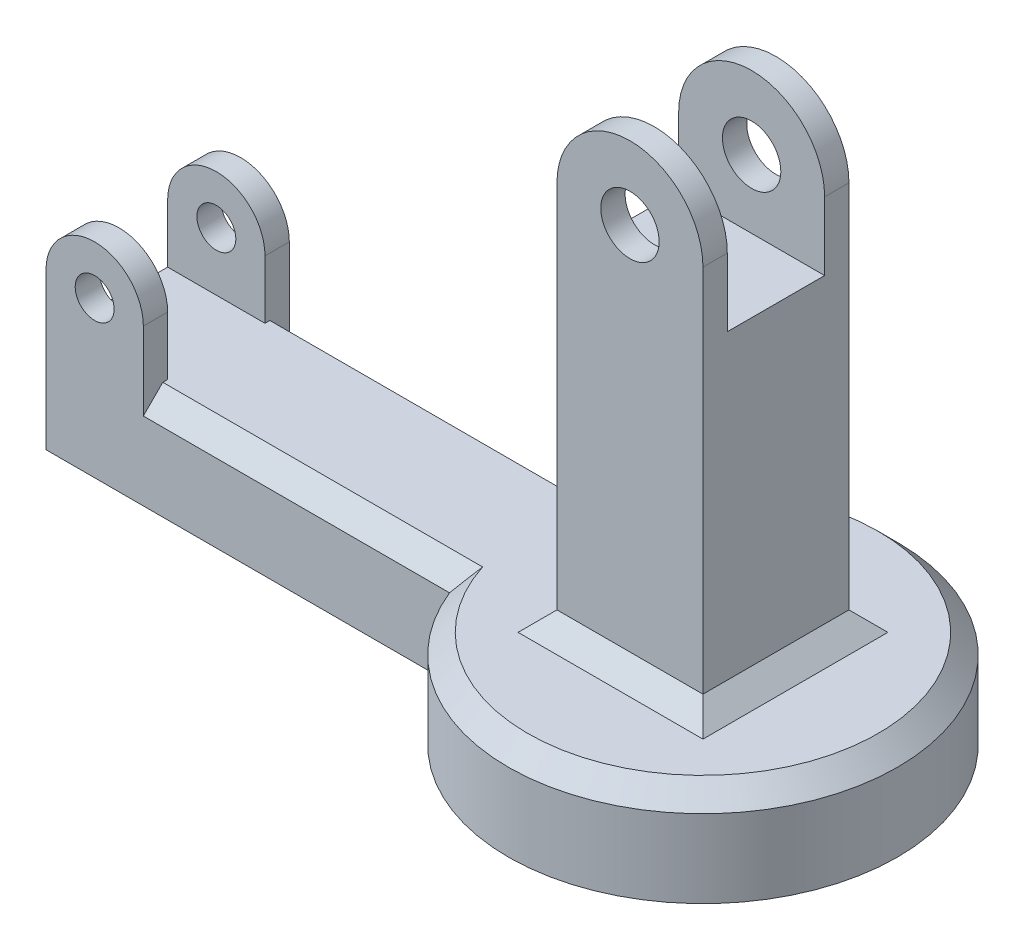
ISO-10303-21;
HEADER;
FILE_DESCRIPTION(('STEP AP214'),'2;1');
FILE_NAME('part.step','',(''),(''),'','','');
FILE_SCHEMA(('AUTOMOTIVE_DESIGN { 1 0 10303 214 1 1 1 1 }'));
ENDSEC;
DATA;
#1=APPLICATION_CONTEXT('core data for automotive mechanical design processes');
#2=APPLICATION_PROTOCOL_DEFINITION('international standard','automotive_design',2000,#1);
#3=PRODUCT_CONTEXT('',#1,'mechanical');
#4=PRODUCT('Part','Part','',(#3));
#5=PRODUCT_RELATED_PRODUCT_CATEGORY('part','',(#4));
#6=PRODUCT_DEFINITION_FORMATION('','',#4);
#7=PRODUCT_DEFINITION_CONTEXT('part definition',#1,'design');
#8=PRODUCT_DEFINITION('design','',#6,#7);
#9=PRODUCT_DEFINITION_SHAPE('','',#8);
#10=(LENGTH_UNIT() NAMED_UNIT(*) SI_UNIT(.MILLI.,.METRE.));
#11=(NAMED_UNIT(*) PLANE_ANGLE_UNIT() SI_UNIT($,.RADIAN.));
#12=(NAMED_UNIT(*) SI_UNIT($,.STERADIAN.) SOLID_ANGLE_UNIT());
#13=UNCERTAINTY_MEASURE_WITH_UNIT(LENGTH_MEASURE(1.E-05),#10,'distance_accuracy_value','');
#14=(GEOMETRIC_REPRESENTATION_CONTEXT(3) GLOBAL_UNCERTAINTY_ASSIGNED_CONTEXT((#13)) GLOBAL_UNIT_ASSIGNED_CONTEXT((#10,
#11,#12)) REPRESENTATION_CONTEXT('',''));
#15=CARTESIAN_POINT('',(0.,0.,0.));
#16=DIRECTION('',(0.,0.,1.));
#17=DIRECTION('',(1.,0.,0.));
#18=AXIS2_PLACEMENT_3D('',#15,#16,#17);
#19=CARTESIAN_POINT('',(-250.,80.,37.5));
#20=DIRECTION('',(-1.,0.,0.));
#21=DIRECTION('',(0.,0.,1.));
#22=AXIS2_PLACEMENT_3D('',#19,#20,#21);
#23=PLANE('',#22);
#24=DIRECTION('',(0.,1.,0.));
#25=VECTOR('',#24,1.);
#26=CARTESIAN_POINT('',(-250.,50.,25.));
#27=LINE('',#26,#25);
#28=CARTESIAN_POINT('',(-250.,50.,25.));
#29=VERTEX_POINT('',#28);
#30=CARTESIAN_POINT('',(-250.,80.,25.));
#31=VERTEX_POINT('',#30);
#32=EDGE_CURVE('E195',#29,#31,#27,.T.);
#33=ORIENTED_EDGE('',*,*,#32,.T.);
#34=DIRECTION('',(0.,0.,-1.));
#35=VECTOR('',#34,1.);
#36=CARTESIAN_POINT('',(-250.,80.,37.5));
#37=LINE('',#36,#35);
#38=CARTESIAN_POINT('',(-250.,80.,37.5));
#39=VERTEX_POINT('',#38);
#40=EDGE_CURVE('E296',#39,#31,#37,.T.);
#41=ORIENTED_EDGE('',*,*,#40,.F.);
#42=DIRECTION('',(0.,1.,0.));
#43=VECTOR('',#42,1.);
#44=CARTESIAN_POINT('',(-250.,80.,37.5));
#45=LINE('',#44,#43);
#46=CARTESIAN_POINT('',(-250.,40.,37.5));
#47=VERTEX_POINT('',#46);
#48=EDGE_CURVE('E289',#47,#39,#45,.T.);
#49=ORIENTED_EDGE('',*,*,#48,.F.);
#50=DIRECTION('',(0.,-0.707106781186549,0.707106781186546));
#51=VECTOR('',#50,1.);
#52=CARTESIAN_POINT('',(-250.,60.0000000000001,17.5));
#53=LINE('',#52,#51);
#54=CARTESIAN_POINT('',(-250.,50.,27.5));
#55=VERTEX_POINT('',#54);
#56=EDGE_CURVE('E352',#47,#55,#53,.F.);
#57=ORIENTED_EDGE('',*,*,#56,.T.);
#58=DIRECTION('',(0.,0.,-1.));
#59=VECTOR('',#58,1.);
#60=CARTESIAN_POINT('',(-250.,50.,37.5));
#61=LINE('',#60,#59);
#62=EDGE_CURVE('E305',#55,#29,#61,.T.);
#63=ORIENTED_EDGE('',*,*,#62,.T.);
#64=EDGE_LOOP('',(#33,#41,#49,#57,#63));
#65=FACE_BOUND('',#64,.T.);
#66=ADVANCED_FACE('F35',(#65),#23,.F.);
#67=CARTESIAN_POINT('',(-275.,80.,37.5));
#68=DIRECTION('',(0.,0.,-1.));
#69=DIRECTION('',(-1.,0.,0.));
#70=AXIS2_PLACEMENT_3D('',#67,#68,#69);
#71=CYLINDRICAL_SURFACE('',#70,25.);
#72=CARTESIAN_POINT('',(-275.,80.,25.));
#73=DIRECTION('',(0.,0.,-1.));
#74=DIRECTION('',(-1.,0.,0.));
#75=AXIS2_PLACEMENT_3D('',#72,#73,#74);
#76=CIRCLE('',#75,25.);
#77=CARTESIAN_POINT('',(-300.,80.,25.));
#78=VERTEX_POINT('',#77);
#79=EDGE_CURVE('E215',#78,#31,#76,.T.);
#80=ORIENTED_EDGE('',*,*,#79,.F.);
#81=DIRECTION('',(0.,0.,-1.));
#82=VECTOR('',#81,1.);
#83=CARTESIAN_POINT('',(-300.,80.,37.5));
#84=LINE('',#83,#82);
#85=CARTESIAN_POINT('',(-300.,80.,37.5));
#86=VERTEX_POINT('',#85);
#87=EDGE_CURVE('E293',#86,#78,#84,.T.);
#88=ORIENTED_EDGE('',*,*,#87,.F.);
#89=CARTESIAN_POINT('',(-275.,80.,37.5));
#90=DIRECTION('',(0.,0.,1.));
#91=DIRECTION('',(-1.,0.,0.));
#92=AXIS2_PLACEMENT_3D('',#89,#90,#91);
#93=CIRCLE('',#92,25.);
#94=EDGE_CURVE('E285',#39,#86,#93,.T.);
#95=ORIENTED_EDGE('',*,*,#94,.F.);
#96=ORIENTED_EDGE('',*,*,#40,.T.);
#97=EDGE_LOOP('',(#80,#88,#95,#96));
#98=FACE_BOUND('',#97,.T.);
#99=ADVANCED_FACE('F406',(#98),#71,.T.);
#100=CARTESIAN_POINT('',(-275.,80.,37.5));
#101=DIRECTION('',(0.,0.,-1.));
#102=DIRECTION('',(-1.,0.,0.));
#103=AXIS2_PLACEMENT_3D('',#100,#101,#102);
#104=CYLINDRICAL_SURFACE('',#103,9.99999999999998);
#105=CARTESIAN_POINT('',(-275.,80.,37.5));
#106=DIRECTION('',(0.,0.,1.));
#107=DIRECTION('',(1.,0.,0.));
#108=AXIS2_PLACEMENT_3D('',#105,#106,#107);
#109=CIRCLE('',#108,9.99999999999998);
#110=CARTESIAN_POINT('',(-265.,80.,37.5));
#111=VERTEX_POINT('',#110);
#112=EDGE_CURVE('E279',#111,#111,#109,.T.);
#113=ORIENTED_EDGE('',*,*,#112,.T.);
#114=EDGE_LOOP('',(#113));
#115=FACE_BOUND('',#114,.T.);
#116=CARTESIAN_POINT('',(-275.,80.,25.));
#117=DIRECTION('',(0.,0.,-1.));
#118=DIRECTION('',(-1.,0.,0.));
#119=AXIS2_PLACEMENT_3D('',#116,#117,#118);
#120=CIRCLE('',#119,9.99999999999998);
#121=CARTESIAN_POINT('',(-285.,80.,25.));
#122=VERTEX_POINT('',#121);
#123=EDGE_CURVE('E212',#122,#122,#120,.T.);
#124=ORIENTED_EDGE('',*,*,#123,.T.);
#125=EDGE_LOOP('',(#124));
#126=FACE_BOUND('',#125,.T.);
#127=ADVANCED_FACE('F412',(#115,#126),#104,.F.);
#128=CARTESIAN_POINT('',(-37.5,50.,37.5));
#129=DIRECTION('',(1.,0.,0.));
#130=DIRECTION('',(0.,0.,-1.));
#131=AXIS2_PLACEMENT_3D('',#128,#129,#130);
#132=PLANE('',#131);
#133=DIRECTION('',(0.,-1.,0.));
#134=VECTOR('',#133,1.);
#135=CARTESIAN_POINT('',(-37.5,50.,-37.5));
#136=LINE('',#135,#134);
#137=CARTESIAN_POINT('',(-37.5,250.,-37.5));
#138=VERTEX_POINT('',#137);
#139=CARTESIAN_POINT('',(-37.5,60.,-37.5));
#140=VERTEX_POINT('',#139);
#141=EDGE_CURVE('E255',#138,#140,#136,.T.);
#142=ORIENTED_EDGE('',*,*,#141,.T.);
#143=DIRECTION('',(0.,0.,1.));
#144=VECTOR('',#143,1.);
#145=CARTESIAN_POINT('',(-37.5,60.,37.5));
#146=LINE('',#145,#144);
#147=CARTESIAN_POINT('',(-37.5,60.,37.5));
#148=VERTEX_POINT('',#147);
#149=EDGE_CURVE('E44',#140,#148,#146,.T.);
#150=ORIENTED_EDGE('',*,*,#149,.T.);
#151=DIRECTION('',(0.,-1.,0.));
#152=VECTOR('',#151,1.);
#153=CARTESIAN_POINT('',(-37.5,50.,37.5));
#154=LINE('',#153,#152);
#155=CARTESIAN_POINT('',(-37.5,250.,37.5));
#156=VERTEX_POINT('',#155);
#157=EDGE_CURVE('E258',#156,#148,#154,.T.);
#158=ORIENTED_EDGE('',*,*,#157,.F.);
#159=DIRECTION('',(0.,0.,-1.));
#160=VECTOR('',#159,1.);
#161=CARTESIAN_POINT('',(-37.5,250.,37.5));
#162=LINE('',#161,#160);
#163=CARTESIAN_POINT('',(-37.5,250.,25.));
#164=VERTEX_POINT('',#163);
#165=EDGE_CURVE('E271',#156,#164,#162,.T.);
#166=ORIENTED_EDGE('',*,*,#165,.T.);
#167=DIRECTION('',(0.,-1.,0.));
#168=VECTOR('',#167,1.);
#169=CARTESIAN_POINT('',(-37.5,215.,25.));
#170=LINE('',#169,#168);
#171=CARTESIAN_POINT('',(-37.5,215.,25.));
#172=VERTEX_POINT('',#171);
#173=EDGE_CURVE('E224',#164,#172,#170,.T.);
#174=ORIENTED_EDGE('',*,*,#173,.T.);
#175=DIRECTION('',(0.,0.,1.));
#176=VECTOR('',#175,1.);
#177=CARTESIAN_POINT('',(-37.5,215.,-25.));
#178=LINE('',#177,#176);
#179=CARTESIAN_POINT('',(-37.5,215.,-25.));
#180=VERTEX_POINT('',#179);
#181=EDGE_CURVE('E233',#180,#172,#178,.T.);
#182=ORIENTED_EDGE('',*,*,#181,.F.);
#183=DIRECTION('',(0.,-1.,0.));
#184=VECTOR('',#183,1.);
#185=CARTESIAN_POINT('',(-37.5,215.,-25.));
#186=LINE('',#185,#184);
#187=CARTESIAN_POINT('',(-37.5,250.,-25.));
#188=VERTEX_POINT('',#187);
#189=EDGE_CURVE('E225',#188,#180,#186,.T.);
#190=ORIENTED_EDGE('',*,*,#189,.F.);
#191=EDGE_CURVE('E265',#188,#138,#162,.T.);
#192=ORIENTED_EDGE('',*,*,#191,.T.);
#193=EDGE_LOOP('',(#142,#150,#158,#166,#174,#182,#190,#192));
#194=FACE_BOUND('',#193,.T.);
#195=ADVANCED_FACE('F629',(#194),#132,.F.);
#196=CARTESIAN_POINT('',(37.5,50.,37.5));
#197=DIRECTION('',(-1.,0.,0.));
#198=DIRECTION('',(0.,0.,1.));
#199=AXIS2_PLACEMENT_3D('',#196,#197,#198);
#200=PLANE('',#199);
#201=DIRECTION('',(0.,1.,0.));
#202=VECTOR('',#201,1.);
#203=CARTESIAN_POINT('',(37.5,50.,37.5));
#204=LINE('',#203,#202);
#205=CARTESIAN_POINT('',(37.5,60.,37.5));
#206=VERTEX_POINT('',#205);
#207=CARTESIAN_POINT('',(37.5,250.,37.5));
#208=VERTEX_POINT('',#207);
#209=EDGE_CURVE('E260',#206,#208,#204,.T.);
#210=ORIENTED_EDGE('',*,*,#209,.F.);
#211=DIRECTION('',(0.,0.,-1.));
#212=VECTOR('',#211,1.);
#213=CARTESIAN_POINT('',(37.5,60.,37.5));
#214=LINE('',#213,#212);
#215=CARTESIAN_POINT('',(37.5,60.,-37.5));
#216=VERTEX_POINT('',#215);
#217=EDGE_CURVE('E380',#206,#216,#214,.T.);
#218=ORIENTED_EDGE('',*,*,#217,.T.);
#219=DIRECTION('',(0.,1.,0.));
#220=VECTOR('',#219,1.);
#221=CARTESIAN_POINT('',(37.5,50.,-37.5));
#222=LINE('',#221,#220);
#223=CARTESIAN_POINT('',(37.5,250.,-37.5));
#224=VERTEX_POINT('',#223);
#225=EDGE_CURVE('E267',#216,#224,#222,.T.);
#226=ORIENTED_EDGE('',*,*,#225,.T.);
#227=DIRECTION('',(0.,0.,-1.));
#228=VECTOR('',#227,1.);
#229=CARTESIAN_POINT('',(37.5,250.,37.5));
#230=LINE('',#229,#228);
#231=CARTESIAN_POINT('',(37.5,250.,-25.));
#232=VERTEX_POINT('',#231);
#233=EDGE_CURVE('E274',#232,#224,#230,.T.);
#234=ORIENTED_EDGE('',*,*,#233,.F.);
#235=DIRECTION('',(0.,1.,0.));
#236=VECTOR('',#235,1.);
#237=CARTESIAN_POINT('',(37.5,215.,-25.));
#238=LINE('',#237,#236);
#239=CARTESIAN_POINT('',(37.5,215.,-25.));
#240=VERTEX_POINT('',#239);
#241=EDGE_CURVE('E231',#240,#232,#238,.T.);
#242=ORIENTED_EDGE('',*,*,#241,.F.);
#243=DIRECTION('',(0.,0.,1.));
#244=VECTOR('',#243,1.);
#245=CARTESIAN_POINT('',(37.5,215.,-25.));
#246=LINE('',#245,#244);
#247=CARTESIAN_POINT('',(37.5,215.,25.));
#248=VERTEX_POINT('',#247);
#249=EDGE_CURVE('E241',#240,#248,#246,.T.);
#250=ORIENTED_EDGE('',*,*,#249,.T.);
#251=DIRECTION('',(0.,1.,0.));
#252=VECTOR('',#251,1.);
#253=CARTESIAN_POINT('',(37.5,215.,25.));
#254=LINE('',#253,#252);
#255=CARTESIAN_POINT('',(37.5,250.,25.));
#256=VERTEX_POINT('',#255);
#257=EDGE_CURVE('E228',#248,#256,#254,.T.);
#258=ORIENTED_EDGE('',*,*,#257,.T.);
#259=EDGE_CURVE('E275',#208,#256,#230,.T.);
#260=ORIENTED_EDGE('',*,*,#259,.F.);
#261=EDGE_LOOP('',(#210,#218,#226,#234,#242,#250,#258,#260));
#262=FACE_BOUND('',#261,.T.);
#263=ADVANCED_FACE('F618',(#262),#200,.F.);
#264=CARTESIAN_POINT('',(0.,250.,37.5));
#265=DIRECTION('',(0.,0.,-1.));
#266=DIRECTION('',(-1.,0.,0.));
#267=AXIS2_PLACEMENT_3D('',#264,#265,#266);
#268=CYLINDRICAL_SURFACE('',#267,37.5);
#269=CARTESIAN_POINT('',(0.,250.,-25.));
#270=DIRECTION('',(0.,0.,1.));
#271=DIRECTION('',(1.,0.,0.));
#272=AXIS2_PLACEMENT_3D('',#269,#270,#271);
#273=CIRCLE('',#272,37.5);
#274=EDGE_CURVE('E249',#232,#188,#273,.T.);
#275=ORIENTED_EDGE('',*,*,#274,.F.);
#276=ORIENTED_EDGE('',*,*,#233,.T.);
#277=CARTESIAN_POINT('',(0.,250.,-37.5));
#278=DIRECTION('',(0.,0.,1.));
#279=DIRECTION('',(-1.,0.,0.));
#280=AXIS2_PLACEMENT_3D('',#277,#278,#279);
#281=CIRCLE('',#280,37.5);
#282=EDGE_CURVE('E261',#224,#138,#281,.T.);
#283=ORIENTED_EDGE('',*,*,#282,.T.);
#284=ORIENTED_EDGE('',*,*,#191,.F.);
#285=EDGE_LOOP('',(#275,#276,#283,#284));
#286=FACE_BOUND('',#285,.T.);
#287=ADVANCED_FACE('F488',(#286),#268,.T.);
#288=CARTESIAN_POINT('',(0.,250.,37.5));
#289=DIRECTION('',(0.,0.,-1.));
#290=DIRECTION('',(-1.,0.,0.));
#291=AXIS2_PLACEMENT_3D('',#288,#289,#290);
#292=CYLINDRICAL_SURFACE('',#291,15.);
#293=CARTESIAN_POINT('',(0.,250.,-37.5));
#294=DIRECTION('',(0.,0.,1.));
#295=DIRECTION('',(1.,0.,0.));
#296=AXIS2_PLACEMENT_3D('',#293,#294,#295);
#297=CIRCLE('',#296,15.);
#298=CARTESIAN_POINT('',(15.,250.,-37.5));
#299=VERTEX_POINT('',#298);
#300=EDGE_CURVE('E251',#299,#299,#297,.T.);
#301=ORIENTED_EDGE('',*,*,#300,.F.);
#302=EDGE_LOOP('',(#301));
#303=FACE_BOUND('',#302,.T.);
#304=CARTESIAN_POINT('',(0.,250.,-25.));
#305=DIRECTION('',(0.,0.,1.));
#306=DIRECTION('',(1.,0.,0.));
#307=AXIS2_PLACEMENT_3D('',#304,#305,#306);
#308=CIRCLE('',#307,15.);
#309=CARTESIAN_POINT('',(15.,250.,-25.));
#310=VERTEX_POINT('',#309);
#311=EDGE_CURVE('E248',#310,#310,#308,.T.);
#312=ORIENTED_EDGE('',*,*,#311,.T.);
#313=EDGE_LOOP('',(#312));
#314=FACE_BOUND('',#313,.T.);
#315=ADVANCED_FACE('F481',(#303,#314),#292,.F.);
#316=CARTESIAN_POINT('',(0.,50.,0.));
#317=DIRECTION('',(0.,1.,0.));
#318=DIRECTION('',(0.,0.,1.));
#319=AXIS2_PLACEMENT_3D('',#316,#317,#318);
#320=PLANE('',#319);
#321=DIRECTION('',(1.,0.,0.));
#322=VECTOR('',#321,1.);
#323=CARTESIAN_POINT('',(37.5,50.,-47.5000000000001));
#324=LINE('',#323,#322);
#325=CARTESIAN_POINT('',(-47.5000000000001,50.,-47.5000000000001));
#326=VERTEX_POINT('',#325);
#327=CARTESIAN_POINT('',(47.5000000000001,50.,-47.5000000000001));
#328=VERTEX_POINT('',#327);
#329=EDGE_CURVE('E450',#326,#328,#324,.T.);
#330=ORIENTED_EDGE('',*,*,#329,.T.);
#331=DIRECTION('',(0.,0.,1.));
#332=VECTOR('',#331,1.);
#333=CARTESIAN_POINT('',(47.5000000000001,50.,0.));
#334=LINE('',#333,#332);
#335=CARTESIAN_POINT('',(47.5000000000001,50.,47.5000000000001));
#336=VERTEX_POINT('',#335);
#337=EDGE_CURVE('E463',#328,#336,#334,.T.);
#338=ORIENTED_EDGE('',*,*,#337,.T.);
#339=DIRECTION('',(-1.,0.,0.));
#340=VECTOR('',#339,1.);
#341=CARTESIAN_POINT('',(0.,50.,47.5000000000001));
#342=LINE('',#341,#340);
#343=CARTESIAN_POINT('',(-47.5000000000001,50.,47.5000000000001));
#344=VERTEX_POINT('',#343);
#345=EDGE_CURVE('E459',#336,#344,#342,.T.);
#346=ORIENTED_EDGE('',*,*,#345,.T.);
#347=DIRECTION('',(0.,0.,-1.));
#348=VECTOR('',#347,1.);
#349=CARTESIAN_POINT('',(-47.5000000000001,50.,0.));
#350=LINE('',#349,#348);
#351=EDGE_CURVE('E454',#344,#326,#350,.T.);
#352=ORIENTED_EDGE('',*,*,#351,.T.);
#353=EDGE_LOOP('',(#330,#338,#346,#352));
#354=FACE_BOUND('',#353,.T.);
#355=CARTESIAN_POINT('',(0.,50.,0.));
#356=DIRECTION('',(0.,1.,0.));
#357=DIRECTION('',(0.,0.,1.));
#358=AXIS2_PLACEMENT_3D('',#355,#356,#357);
#359=CIRCLE('',#358,90.0000000000001);
#360=CARTESIAN_POINT('',(-85.6956825050131,50.,27.5));
#361=VERTEX_POINT('',#360);
#362=CARTESIAN_POINT('',(-85.6956825050131,50.,-27.5));
#363=VERTEX_POINT('',#362);
#364=EDGE_CURVE('E505',#361,#363,#359,.T.);
#365=ORIENTED_EDGE('',*,*,#364,.T.);
#366=DIRECTION('',(-1.,0.,0.));
#367=VECTOR('',#366,1.);
#368=CARTESIAN_POINT('',(0.,50.,-27.5));
#369=LINE('',#368,#367);
#370=CARTESIAN_POINT('',(-250.,50.,-27.5));
#371=VERTEX_POINT('',#370);
#372=EDGE_CURVE('E504',#363,#371,#369,.T.);
#373=ORIENTED_EDGE('',*,*,#372,.T.);
#374=CARTESIAN_POINT('',(-250.,50.,-25.));
#375=VERTEX_POINT('',#374);
#376=EDGE_CURVE('E205',#375,#371,#61,.T.);
#377=ORIENTED_EDGE('',*,*,#376,.F.);
#378=DIRECTION('',(1.,0.,0.));
#379=VECTOR('',#378,1.);
#380=CARTESIAN_POINT('',(-300.,50.,-25.));
#381=LINE('',#380,#379);
#382=CARTESIAN_POINT('',(-300.,50.,-25.));
#383=VERTEX_POINT('',#382);
#384=EDGE_CURVE('E189',#383,#375,#381,.T.);
#385=ORIENTED_EDGE('',*,*,#384,.F.);
#386=DIRECTION('',(0.,0.,1.));
#387=VECTOR('',#386,1.);
#388=CARTESIAN_POINT('',(-300.,50.,-25.));
#389=LINE('',#388,#387);
#390=CARTESIAN_POINT('',(-300.,50.,25.));
#391=VERTEX_POINT('',#390);
#392=EDGE_CURVE('E201',#383,#391,#389,.T.);
#393=ORIENTED_EDGE('',*,*,#392,.T.);
#394=DIRECTION('',(1.,0.,0.));
#395=VECTOR('',#394,1.);
#396=CARTESIAN_POINT('',(-300.,50.,25.));
#397=LINE('',#396,#395);
#398=EDGE_CURVE('E356',#391,#29,#397,.T.);
#399=ORIENTED_EDGE('',*,*,#398,.T.);
#400=ORIENTED_EDGE('',*,*,#62,.F.);
#401=DIRECTION('',(1.,0.,0.));
#402=VECTOR('',#401,1.);
#403=CARTESIAN_POINT('',(0.,50.,27.5));
#404=LINE('',#403,#402);
#405=EDGE_CURVE('E325',#55,#361,#404,.T.);
#406=ORIENTED_EDGE('',*,*,#405,.T.);
#407=EDGE_LOOP('',(#365,#373,#377,#385,#393,#399,#400,#406));
#408=FACE_BOUND('',#407,.T.);
#409=ADVANCED_FACE('F199',(#354,#408),#320,.T.);
#410=CARTESIAN_POINT('',(0.,50.,0.));
#411=DIRECTION('',(0.,-1.,0.));
#412=DIRECTION('',(0.,0.,-1.));
#413=AXIS2_PLACEMENT_3D('',#410,#411,#412);
#414=CYLINDRICAL_SURFACE('',#413,100.);
#415=DIRECTION('',(0.,-1.,0.));
#416=VECTOR('',#415,1.);
#417=CARTESIAN_POINT('',(-92.7024810886958,50.,-37.5));
#418=LINE('',#417,#416);
#419=CARTESIAN_POINT('',(-92.7024810886958,0.,-37.5));
#420=VERTEX_POINT('',#419);
#421=CARTESIAN_POINT('',(-92.7024810886958,40.,-37.5));
#422=VERTEX_POINT('',#421);
#423=EDGE_CURVE('E326',#420,#422,#418,.F.);
#424=ORIENTED_EDGE('',*,*,#423,.T.);
#425=CARTESIAN_POINT('',(0.,40.,0.));
#426=DIRECTION('',(0.,1.,0.));
#427=DIRECTION('',(0.,0.,1.));
#428=AXIS2_PLACEMENT_3D('',#425,#426,#427);
#429=CIRCLE('',#428,100.);
#430=CARTESIAN_POINT('',(-92.7024810886958,40.,37.5));
#431=VERTEX_POINT('',#430);
#432=EDGE_CURVE('E438',#422,#431,#429,.F.);
#433=ORIENTED_EDGE('',*,*,#432,.T.);
#434=DIRECTION('',(0.,-1.,0.));
#435=VECTOR('',#434,1.);
#436=CARTESIAN_POINT('',(-92.7024810886958,50.,37.5));
#437=LINE('',#436,#435);
#438=CARTESIAN_POINT('',(-92.7024810886958,0.,37.5));
#439=VERTEX_POINT('',#438);
#440=EDGE_CURVE('E329',#431,#439,#437,.T.);
#441=ORIENTED_EDGE('',*,*,#440,.T.);
#442=CARTESIAN_POINT('',(0.,0.,0.));
#443=DIRECTION('',(0.,1.,0.));
#444=DIRECTION('',(0.,0.,1.));
#445=AXIS2_PLACEMENT_3D('',#442,#443,#444);
#446=CIRCLE('',#445,100.);
#447=EDGE_CURVE('E322',#439,#420,#446,.T.);
#448=ORIENTED_EDGE('',*,*,#447,.T.);
#449=EDGE_LOOP('',(#424,#433,#441,#448));
#450=FACE_BOUND('',#449,.T.);
#451=ADVANCED_FACE('F437',(#450),#414,.T.);
#452=CARTESIAN_POINT('',(0.,0.,0.));
#453=DIRECTION('',(0.,1.,0.));
#454=DIRECTION('',(0.,0.,1.));
#455=AXIS2_PLACEMENT_3D('',#452,#453,#454);
#456=PLANE('',#455);
#457=ORIENTED_EDGE('',*,*,#447,.F.);
#458=DIRECTION('',(1.,0.,0.));
#459=VECTOR('',#458,1.);
#460=CARTESIAN_POINT('',(-300.,0.,37.5));
#461=LINE('',#460,#459);
#462=CARTESIAN_POINT('',(-300.,0.,37.5));
#463=VERTEX_POINT('',#462);
#464=EDGE_CURVE('E337',#463,#439,#461,.T.);
#465=ORIENTED_EDGE('',*,*,#464,.F.);
#466=DIRECTION('',(0.,0.,1.));
#467=VECTOR('',#466,1.);
#468=CARTESIAN_POINT('',(-300.,0.,-37.5));
#469=LINE('',#468,#467);
#470=CARTESIAN_POINT('',(-300.,0.,-37.5));
#471=VERTEX_POINT('',#470);
#472=EDGE_CURVE('E301',#471,#463,#469,.T.);
#473=ORIENTED_EDGE('',*,*,#472,.F.);
#474=DIRECTION('',(-1.,0.,0.));
#475=VECTOR('',#474,1.);
#476=CARTESIAN_POINT('',(-300.,0.,-37.5));
#477=LINE('',#476,#475);
#478=EDGE_CURVE('E334',#420,#471,#477,.T.);
#479=ORIENTED_EDGE('',*,*,#478,.F.);
#480=EDGE_LOOP('',(#457,#465,#473,#479));
#481=FACE_BOUND('',#480,.T.);
#482=ADVANCED_FACE('F435',(#481),#456,.F.);
#483=CARTESIAN_POINT('',(-300.,0.,-37.5));
#484=DIRECTION('',(0.,0.,-1.));
#485=DIRECTION('',(-1.,0.,0.));
#486=AXIS2_PLACEMENT_3D('',#483,#484,#485);
#487=PLANE('',#486);
#488=DIRECTION('',(0.,1.,0.));
#489=VECTOR('',#488,1.);
#490=CARTESIAN_POINT('',(-250.,80.,-37.5));
#491=LINE('',#490,#489);
#492=CARTESIAN_POINT('',(-250.,40.,-37.5));
#493=VERTEX_POINT('',#492);
#494=CARTESIAN_POINT('',(-250.,80.,-37.5));
#495=VERTEX_POINT('',#494);
#496=EDGE_CURVE('E282',#493,#495,#491,.T.);
#497=ORIENTED_EDGE('',*,*,#496,.F.);
#498=DIRECTION('',(1.,0.,0.));
#499=VECTOR('',#498,1.);
#500=CARTESIAN_POINT('',(-300.,40.,-37.5));
#501=LINE('',#500,#499);
#502=EDGE_CURVE('E446',#493,#422,#501,.T.);
#503=ORIENTED_EDGE('',*,*,#502,.T.);
#504=ORIENTED_EDGE('',*,*,#423,.F.);
#505=ORIENTED_EDGE('',*,*,#478,.T.);
#506=DIRECTION('',(0.,1.,0.));
#507=VECTOR('',#506,1.);
#508=CARTESIAN_POINT('',(-300.,0.,-37.5));
#509=LINE('',#508,#507);
#510=CARTESIAN_POINT('',(-300.,80.,-37.5));
#511=VERTEX_POINT('',#510);
#512=EDGE_CURVE('E331',#471,#511,#509,.T.);
#513=ORIENTED_EDGE('',*,*,#512,.T.);
#514=CARTESIAN_POINT('',(-275.,80.,-37.5));
#515=DIRECTION('',(0.,0.,1.));
#516=DIRECTION('',(-1.,0.,0.));
#517=AXIS2_PLACEMENT_3D('',#514,#515,#516);
#518=CIRCLE('',#517,25.);
#519=EDGE_CURVE('E290',#495,#511,#518,.T.);
#520=ORIENTED_EDGE('',*,*,#519,.F.);
#521=EDGE_LOOP('',(#497,#503,#504,#505,#513,#520));
#522=FACE_BOUND('',#521,.T.);
#523=CARTESIAN_POINT('',(-275.,80.,-37.5));
#524=DIRECTION('',(0.,0.,1.));
#525=DIRECTION('',(1.,0.,0.));
#526=AXIS2_PLACEMENT_3D('',#523,#524,#525);
#527=CIRCLE('',#526,9.99999999999998);
#528=CARTESIAN_POINT('',(-265.,80.,-37.5));
#529=VERTEX_POINT('',#528);
#530=EDGE_CURVE('E278',#529,#529,#527,.T.);
#531=ORIENTED_EDGE('',*,*,#530,.T.);
#532=EDGE_LOOP('',(#531));
#533=FACE_BOUND('',#532,.T.);
#534=ADVANCED_FACE('F431',(#522,#533),#487,.T.);
#535=CARTESIAN_POINT('',(-300.,0.,37.5));
#536=DIRECTION('',(0.,0.,1.));
#537=DIRECTION('',(1.,0.,0.));
#538=AXIS2_PLACEMENT_3D('',#535,#536,#537);
#539=PLANE('',#538);
#540=ORIENTED_EDGE('',*,*,#440,.F.);
#541=DIRECTION('',(-1.,0.,0.));
#542=VECTOR('',#541,1.);
#543=CARTESIAN_POINT('',(-300.,40.,37.5));
#544=LINE('',#543,#542);
#545=EDGE_CURVE('E442',#431,#47,#544,.T.);
#546=ORIENTED_EDGE('',*,*,#545,.T.);
#547=ORIENTED_EDGE('',*,*,#48,.T.);
#548=ORIENTED_EDGE('',*,*,#94,.T.);
#549=DIRECTION('',(0.,1.,0.));
#550=VECTOR('',#549,1.);
#551=CARTESIAN_POINT('',(-300.,0.,37.5));
#552=LINE('',#551,#550);
#553=EDGE_CURVE('E332',#463,#86,#552,.T.);
#554=ORIENTED_EDGE('',*,*,#553,.F.);
#555=ORIENTED_EDGE('',*,*,#464,.T.);
#556=EDGE_LOOP('',(#540,#546,#547,#548,#554,#555));
#557=FACE_BOUND('',#556,.T.);
#558=ORIENTED_EDGE('',*,*,#112,.F.);
#559=EDGE_LOOP('',(#558));
#560=FACE_BOUND('',#559,.T.);
#561=ADVANCED_FACE('F425',(#557,#560),#539,.T.);
#562=CARTESIAN_POINT('',(-300.,0.,-37.5));
#563=DIRECTION('',(-1.,0.,0.));
#564=DIRECTION('',(0.,0.,1.));
#565=AXIS2_PLACEMENT_3D('',#562,#563,#564);
#566=PLANE('',#565);
#567=DIRECTION('',(0.,-1.,0.));
#568=VECTOR('',#567,1.);
#569=CARTESIAN_POINT('',(-300.,50.,-25.));
#570=LINE('',#569,#568);
#571=CARTESIAN_POINT('',(-300.,80.,-25.));
#572=VERTEX_POINT('',#571);
#573=EDGE_CURVE('E185',#572,#383,#570,.T.);
#574=ORIENTED_EDGE('',*,*,#573,.F.);
#575=EDGE_CURVE('E288',#572,#511,#84,.T.);
#576=ORIENTED_EDGE('',*,*,#575,.T.);
#577=ORIENTED_EDGE('',*,*,#512,.F.);
#578=ORIENTED_EDGE('',*,*,#472,.T.);
#579=ORIENTED_EDGE('',*,*,#553,.T.);
#580=ORIENTED_EDGE('',*,*,#87,.T.);
#581=DIRECTION('',(0.,-1.,0.));
#582=VECTOR('',#581,1.);
#583=CARTESIAN_POINT('',(-300.,50.,25.));
#584=LINE('',#583,#582);
#585=EDGE_CURVE('E211',#78,#391,#584,.T.);
#586=ORIENTED_EDGE('',*,*,#585,.T.);
#587=ORIENTED_EDGE('',*,*,#392,.F.);
#588=EDGE_LOOP('',(#574,#576,#577,#578,#579,#580,#586,#587));
#589=FACE_BOUND('',#588,.T.);
#590=ADVANCED_FACE('F209',(#589),#566,.T.);
#591=CARTESIAN_POINT('',(-250.,80.,-25.));
#592=VERTEX_POINT('',#591);
#593=EDGE_CURVE('E295',#592,#495,#37,.T.);
#594=ORIENTED_EDGE('',*,*,#593,.F.);
#595=DIRECTION('',(0.,1.,0.));
#596=VECTOR('',#595,1.);
#597=CARTESIAN_POINT('',(-250.,50.,-25.));
#598=LINE('',#597,#596);
#599=EDGE_CURVE('E206',#375,#592,#598,.T.);
#600=ORIENTED_EDGE('',*,*,#599,.F.);
#601=ORIENTED_EDGE('',*,*,#376,.T.);
#602=DIRECTION('',(0.,0.707106781186549,0.707106781186546));
#603=VECTOR('',#602,1.);
#604=CARTESIAN_POINT('',(-250.,97.5000000000001,19.9999999999998));
#605=LINE('',#604,#603);
#606=EDGE_CURVE('E443',#371,#493,#605,.F.);
#607=ORIENTED_EDGE('',*,*,#606,.T.);
#608=ORIENTED_EDGE('',*,*,#496,.T.);
#609=EDGE_LOOP('',(#594,#600,#601,#607,#608));
#610=FACE_BOUND('',#609,.T.);
#611=ADVANCED_FACE('F408',(#610),#23,.F.);
#612=ORIENTED_EDGE('',*,*,#575,.F.);
#613=CARTESIAN_POINT('',(-275.,80.,-25.));
#614=DIRECTION('',(0.,0.,-1.));
#615=DIRECTION('',(-1.,0.,0.));
#616=AXIS2_PLACEMENT_3D('',#613,#614,#615);
#617=CIRCLE('',#616,25.);
#618=EDGE_CURVE('E191',#572,#592,#617,.T.);
#619=ORIENTED_EDGE('',*,*,#618,.T.);
#620=ORIENTED_EDGE('',*,*,#593,.T.);
#621=ORIENTED_EDGE('',*,*,#519,.T.);
#622=EDGE_LOOP('',(#612,#619,#620,#621));
#623=FACE_BOUND('',#622,.T.);
#624=ADVANCED_FACE('F415',(#623),#71,.T.);
#625=CARTESIAN_POINT('',(-275.,80.,-25.));
#626=DIRECTION('',(0.,0.,-1.));
#627=DIRECTION('',(-1.,0.,0.));
#628=AXIS2_PLACEMENT_3D('',#625,#626,#627);
#629=CIRCLE('',#628,9.99999999999998);
#630=CARTESIAN_POINT('',(-285.,80.,-25.));
#631=VERTEX_POINT('',#630);
#632=EDGE_CURVE('E222',#631,#631,#629,.T.);
#633=ORIENTED_EDGE('',*,*,#632,.F.);
#634=EDGE_LOOP('',(#633));
#635=FACE_BOUND('',#634,.T.);
#636=ORIENTED_EDGE('',*,*,#530,.F.);
#637=EDGE_LOOP('',(#636));
#638=FACE_BOUND('',#637,.T.);
#639=ADVANCED_FACE('F423',(#635,#638),#104,.F.);
#640=CARTESIAN_POINT('',(0.,250.,37.5));
#641=DIRECTION('',(0.,0.,-1.));
#642=DIRECTION('',(-1.,0.,0.));
#643=AXIS2_PLACEMENT_3D('',#640,#641,#642);
#644=PLANE('',#643);
#645=ORIENTED_EDGE('',*,*,#157,.T.);
#646=DIRECTION('',(1.,0.,0.));
#647=VECTOR('',#646,1.);
#648=CARTESIAN_POINT('',(0.,60.,37.5));
#649=LINE('',#648,#647);
#650=EDGE_CURVE('E465',#148,#206,#649,.T.);
#651=ORIENTED_EDGE('',*,*,#650,.T.);
#652=ORIENTED_EDGE('',*,*,#209,.T.);
#653=CARTESIAN_POINT('',(0.,250.,37.5));
#654=DIRECTION('',(0.,0.,1.));
#655=DIRECTION('',(-1.,0.,0.));
#656=AXIS2_PLACEMENT_3D('',#653,#654,#655);
#657=CIRCLE('',#656,37.5);
#658=EDGE_CURVE('E263',#208,#156,#657,.T.);
#659=ORIENTED_EDGE('',*,*,#658,.T.);
#660=EDGE_LOOP('',(#645,#651,#652,#659));
#661=FACE_BOUND('',#660,.T.);
#662=CARTESIAN_POINT('',(0.,250.,37.5));
#663=DIRECTION('',(0.,0.,1.));
#664=DIRECTION('',(1.,0.,0.));
#665=AXIS2_PLACEMENT_3D('',#662,#663,#664);
#666=CIRCLE('',#665,15.);
#667=CARTESIAN_POINT('',(15.,250.,37.5));
#668=VERTEX_POINT('',#667);
#669=EDGE_CURVE('E252',#668,#668,#666,.T.);
#670=ORIENTED_EDGE('',*,*,#669,.F.);
#671=EDGE_LOOP('',(#670));
#672=FACE_BOUND('',#671,.T.);
#673=ADVANCED_FACE('F574',(#661,#672),#644,.F.);
#674=CARTESIAN_POINT('',(0.,250.,-37.5));
#675=DIRECTION('',(0.,0.,-1.));
#676=DIRECTION('',(-1.,0.,0.));
#677=AXIS2_PLACEMENT_3D('',#674,#675,#676);
#678=PLANE('',#677);
#679=ORIENTED_EDGE('',*,*,#225,.F.);
#680=DIRECTION('',(-1.,0.,0.));
#681=VECTOR('',#680,1.);
#682=CARTESIAN_POINT('',(-37.5,60.,-37.5));
#683=LINE('',#682,#681);
#684=EDGE_CURVE('E11',#216,#140,#683,.T.);
#685=ORIENTED_EDGE('',*,*,#684,.T.);
#686=ORIENTED_EDGE('',*,*,#141,.F.);
#687=ORIENTED_EDGE('',*,*,#282,.F.);
#688=EDGE_LOOP('',(#679,#685,#686,#687));
#689=FACE_BOUND('',#688,.T.);
#690=ORIENTED_EDGE('',*,*,#300,.T.);
#691=EDGE_LOOP('',(#690));
#692=FACE_BOUND('',#691,.T.);
#693=ADVANCED_FACE('F565',(#689,#692),#678,.T.);
#694=ORIENTED_EDGE('',*,*,#259,.T.);
#695=CARTESIAN_POINT('',(0.,250.,25.));
#696=DIRECTION('',(0.,0.,1.));
#697=DIRECTION('',(1.,0.,0.));
#698=AXIS2_PLACEMENT_3D('',#695,#696,#697);
#699=CIRCLE('',#698,37.5);
#700=EDGE_CURVE('E246',#256,#164,#699,.T.);
#701=ORIENTED_EDGE('',*,*,#700,.T.);
#702=ORIENTED_EDGE('',*,*,#165,.F.);
#703=ORIENTED_EDGE('',*,*,#658,.F.);
#704=EDGE_LOOP('',(#694,#701,#702,#703));
#705=FACE_BOUND('',#704,.T.);
#706=ADVANCED_FACE('F558',(#705),#268,.T.);
#707=CARTESIAN_POINT('',(0.,250.,25.));
#708=DIRECTION('',(0.,0.,1.));
#709=DIRECTION('',(1.,0.,0.));
#710=AXIS2_PLACEMENT_3D('',#707,#708,#709);
#711=CIRCLE('',#710,15.);
#712=CARTESIAN_POINT('',(15.,250.,25.));
#713=VERTEX_POINT('',#712);
#714=EDGE_CURVE('E244',#713,#713,#711,.T.);
#715=ORIENTED_EDGE('',*,*,#714,.F.);
#716=EDGE_LOOP('',(#715));
#717=FACE_BOUND('',#716,.T.);
#718=ORIENTED_EDGE('',*,*,#669,.T.);
#719=EDGE_LOOP('',(#718));
#720=FACE_BOUND('',#719,.T.);
#721=ADVANCED_FACE('F491',(#717,#720),#292,.F.);
#722=CARTESIAN_POINT('',(0.,0.,-25.));
#723=DIRECTION('',(0.,0.,1.));
#724=DIRECTION('',(1.,0.,0.));
#725=AXIS2_PLACEMENT_3D('',#722,#723,#724);
#726=PLANE('',#725);
#727=ORIENTED_EDGE('',*,*,#311,.F.);
#728=EDGE_LOOP('',(#727));
#729=FACE_BOUND('',#728,.T.);
#730=ORIENTED_EDGE('',*,*,#274,.T.);
#731=ORIENTED_EDGE('',*,*,#189,.T.);
#732=DIRECTION('',(1.,0.,0.));
#733=VECTOR('',#732,1.);
#734=CARTESIAN_POINT('',(-37.5,215.,-25.));
#735=LINE('',#734,#733);
#736=EDGE_CURVE('E227',#180,#240,#735,.T.);
#737=ORIENTED_EDGE('',*,*,#736,.T.);
#738=ORIENTED_EDGE('',*,*,#241,.T.);
#739=EDGE_LOOP('',(#730,#731,#737,#738));
#740=FACE_BOUND('',#739,.T.);
#741=ADVANCED_FACE('F543',(#729,#740),#726,.T.);
#742=CARTESIAN_POINT('',(0.,0.,25.));
#743=DIRECTION('',(0.,0.,1.));
#744=DIRECTION('',(1.,0.,0.));
#745=AXIS2_PLACEMENT_3D('',#742,#743,#744);
#746=PLANE('',#745);
#747=ORIENTED_EDGE('',*,*,#714,.T.);
#748=EDGE_LOOP('',(#747));
#749=FACE_BOUND('',#748,.T.);
#750=ORIENTED_EDGE('',*,*,#257,.F.);
#751=DIRECTION('',(1.,0.,0.));
#752=VECTOR('',#751,1.);
#753=CARTESIAN_POINT('',(-37.5,215.,25.));
#754=LINE('',#753,#752);
#755=EDGE_CURVE('E236',#172,#248,#754,.T.);
#756=ORIENTED_EDGE('',*,*,#755,.F.);
#757=ORIENTED_EDGE('',*,*,#173,.F.);
#758=ORIENTED_EDGE('',*,*,#700,.F.);
#759=EDGE_LOOP('',(#750,#756,#757,#758));
#760=FACE_BOUND('',#759,.T.);
#761=ADVANCED_FACE('F535',(#749,#760),#746,.F.);
#762=CARTESIAN_POINT('',(-37.5,215.,-25.));
#763=DIRECTION('',(0.,-1.,0.));
#764=DIRECTION('',(0.,0.,-1.));
#765=AXIS2_PLACEMENT_3D('',#762,#763,#764);
#766=PLANE('',#765);
#767=ORIENTED_EDGE('',*,*,#755,.T.);
#768=ORIENTED_EDGE('',*,*,#249,.F.);
#769=ORIENTED_EDGE('',*,*,#736,.F.);
#770=ORIENTED_EDGE('',*,*,#181,.T.);
#771=EDGE_LOOP('',(#767,#768,#769,#770));
#772=FACE_BOUND('',#771,.T.);
#773=ADVANCED_FACE('F527',(#772),#766,.F.);
#774=CARTESIAN_POINT('',(0.,0.,-25.));
#775=DIRECTION('',(0.,0.,-1.));
#776=DIRECTION('',(-1.,0.,0.));
#777=AXIS2_PLACEMENT_3D('',#774,#775,#776);
#778=PLANE('',#777);
#779=ORIENTED_EDGE('',*,*,#632,.T.);
#780=EDGE_LOOP('',(#779));
#781=FACE_BOUND('',#780,.T.);
#782=ORIENTED_EDGE('',*,*,#573,.T.);
#783=ORIENTED_EDGE('',*,*,#384,.T.);
#784=ORIENTED_EDGE('',*,*,#599,.T.);
#785=ORIENTED_EDGE('',*,*,#618,.F.);
#786=EDGE_LOOP('',(#782,#783,#784,#785));
#787=FACE_BOUND('',#786,.T.);
#788=ADVANCED_FACE('F187',(#781,#787),#778,.F.);
#789=CARTESIAN_POINT('',(0.,0.,25.));
#790=DIRECTION('',(0.,0.,-1.));
#791=DIRECTION('',(-1.,0.,0.));
#792=AXIS2_PLACEMENT_3D('',#789,#790,#791);
#793=PLANE('',#792);
#794=ORIENTED_EDGE('',*,*,#123,.F.);
#795=EDGE_LOOP('',(#794));
#796=FACE_BOUND('',#795,.T.);
#797=ORIENTED_EDGE('',*,*,#79,.T.);
#798=ORIENTED_EDGE('',*,*,#32,.F.);
#799=ORIENTED_EDGE('',*,*,#398,.F.);
#800=ORIENTED_EDGE('',*,*,#585,.F.);
#801=EDGE_LOOP('',(#797,#798,#799,#800));
#802=FACE_BOUND('',#801,.T.);
#803=ADVANCED_FACE('F355',(#796,#802),#793,.T.);
#804=CARTESIAN_POINT('',(0.,50.,27.5));
#805=DIRECTION('',(0.,-0.707106781186546,-0.707106781186549));
#806=DIRECTION('',(1.,0.,0.));
#807=AXIS2_PLACEMENT_3D('',#804,#805,#806);
#808=PLANE('',#807);
#809=ORIENTED_EDGE('',*,*,#56,.F.);
#810=ORIENTED_EDGE('',*,*,#545,.F.);
#811=CARTESIAN_POINT('',(-92.7024810886958,40.,37.5));
#812=CARTESIAN_POINT('',(-92.1364546699775,40.8395441997039,36.6604558002961));
#813=CARTESIAN_POINT('',(-91.5662122276571,41.6776698615642,35.8223301384358));
#814=CARTESIAN_POINT('',(-90.4169509003303,43.3508434930904,34.1491565069097));
#815=CARTESIAN_POINT('',(-89.8379325529151,44.1858916474127,33.3141083525873));
#816=CARTESIAN_POINT('',(-88.6707014525021,45.8527786946691,31.6472213053309));
#817=CARTESIAN_POINT('',(-88.0824886272102,46.6846175623051,30.8153824376949));
#818=CARTESIAN_POINT('',(-86.8964169291505,48.3449128818192,29.1550871181809));
#819=CARTESIAN_POINT('',(-86.2985574699528,49.1733691241983,28.3266308758018));
#820=CARTESIAN_POINT('',(-85.6956825050131,50.,27.5));
#821=B_SPLINE_CURVE_WITH_KNOTS('',3,(#811,#812,#813,#814,#815,#816,#817,#818,#819,#820),
.UNSPECIFIED.,.F.,.F.,(4,2,2,2,4),(0.,3.94594312195447,7.89164549384938,11.8373789054949,
15.7833530933392),.UNSPECIFIED.);
#822=EDGE_CURVE('E358',#361,#431,#821,.F.);
#823=ORIENTED_EDGE('',*,*,#822,.F.);
#824=ORIENTED_EDGE('',*,*,#405,.F.);
#825=EDGE_LOOP('',(#809,#810,#823,#824));
#826=FACE_BOUND('',#825,.T.);
#827=ADVANCED_FACE('F384',(#826),#808,.F.);
#828=CARTESIAN_POINT('',(0.,50.,0.));
#829=DIRECTION('',(0.,-1.,0.));
#830=DIRECTION('',(0.,0.,-1.));
#831=AXIS2_PLACEMENT_3D('',#828,#829,#830);
#832=CONICAL_SURFACE('',#831,90.0000000000001,0.785398163397446);
#833=ORIENTED_EDGE('',*,*,#822,.T.);
#834=ORIENTED_EDGE('',*,*,#432,.F.);
#835=CARTESIAN_POINT('',(-92.7024810886958,40.,-37.5));
#836=CARTESIAN_POINT('',(-92.1364546699775,40.8395441997039,-36.6604558002961));
#837=CARTESIAN_POINT('',(-91.5662122276571,41.6776698615642,-35.8223301384358));
#838=CARTESIAN_POINT('',(-90.4169509003303,43.3508434930904,-34.1491565069097));
#839=CARTESIAN_POINT('',(-89.8379325529151,44.1858916474127,-33.3141083525873));
#840=CARTESIAN_POINT('',(-88.6707014525021,45.8527786946691,-31.6472213053309));
#841=CARTESIAN_POINT('',(-88.0824886272102,46.6846175623051,-30.8153824376949));
#842=CARTESIAN_POINT('',(-86.8964169291505,48.3449128818192,-29.1550871181809));
#843=CARTESIAN_POINT('',(-86.2985574699528,49.1733691241983,-28.3266308758018));
#844=CARTESIAN_POINT('',(-85.6956825050131,50.,-27.5));
#845=B_SPLINE_CURVE_WITH_KNOTS('',3,(#835,#836,#837,#838,#839,#840,#841,#842,#843,#844),
.UNSPECIFIED.,.F.,.F.,(4,2,2,2,4),(0.,3.94594312195447,7.89164549384938,11.8373789054949,
15.7833530933392),.UNSPECIFIED.);
#846=EDGE_CURVE('E361',#363,#422,#845,.F.);
#847=ORIENTED_EDGE('',*,*,#846,.F.);
#848=ORIENTED_EDGE('',*,*,#364,.F.);
#849=EDGE_LOOP('',(#833,#834,#847,#848));
#850=FACE_BOUND('',#849,.T.);
#851=ADVANCED_FACE('F382',(#850),#832,.T.);
#852=CARTESIAN_POINT('',(0.,50.,-27.5));
#853=DIRECTION('',(0.,-0.707106781186546,0.707106781186549));
#854=DIRECTION('',(-1.,0.,0.));
#855=AXIS2_PLACEMENT_3D('',#852,#853,#854);
#856=PLANE('',#855);
#857=ORIENTED_EDGE('',*,*,#846,.T.);
#858=ORIENTED_EDGE('',*,*,#502,.F.);
#859=ORIENTED_EDGE('',*,*,#606,.F.);
#860=ORIENTED_EDGE('',*,*,#372,.F.);
#861=EDGE_LOOP('',(#857,#858,#859,#860));
#862=FACE_BOUND('',#861,.T.);
#863=ADVANCED_FACE('F402',(#862),#856,.F.);
#864=CARTESIAN_POINT('',(-47.5000000000001,50.,0.));
#865=DIRECTION('',(0.707106781186543,-0.707106781186551,0.));
#866=DIRECTION('',(0.,0.,-1.));
#867=AXIS2_PLACEMENT_3D('',#864,#865,#866);
#868=PLANE('',#867);
#869=DIRECTION('',(-0.577350269189628,-0.577350269189621,-0.577350269189628));
#870=VECTOR('',#869,1.);
#871=CARTESIAN_POINT('',(-31.6666666666666,65.8333333333333,-31.6666666666666));
#872=LINE('',#871,#870);
#873=EDGE_CURVE('E471',#326,#140,#872,.F.);
#874=ORIENTED_EDGE('',*,*,#873,.F.);
#875=ORIENTED_EDGE('',*,*,#351,.F.);
#876=DIRECTION('',(0.577350269189628,0.577350269189621,-0.577350269189628));
#877=VECTOR('',#876,1.);
#878=CARTESIAN_POINT('',(-31.6666666666666,65.8333333333333,31.6666666666666));
#879=LINE('',#878,#877);
#880=EDGE_CURVE('E39',#148,#344,#879,.F.);
#881=ORIENTED_EDGE('',*,*,#880,.F.);
#882=ORIENTED_EDGE('',*,*,#149,.F.);
#883=EDGE_LOOP('',(#874,#875,#881,#882));
#884=FACE_BOUND('',#883,.T.);
#885=ADVANCED_FACE('F37',(#884),#868,.F.);
#886=CARTESIAN_POINT('',(0.,60.,37.5));
#887=DIRECTION('',(0.,-0.707106781186552,-0.707106781186543));
#888=DIRECTION('',(1.,0.,0.));
#889=AXIS2_PLACEMENT_3D('',#886,#887,#888);
#890=PLANE('',#889);
#891=ORIENTED_EDGE('',*,*,#880,.T.);
#892=ORIENTED_EDGE('',*,*,#345,.F.);
#893=DIRECTION('',(-0.577350269189628,0.577350269189621,-0.577350269189628));
#894=VECTOR('',#893,1.);
#895=CARTESIAN_POINT('',(24.9999999999999,72.4999999999999,24.9999999999999));
#896=LINE('',#895,#894);
#897=EDGE_CURVE('E470',#206,#336,#896,.F.);
#898=ORIENTED_EDGE('',*,*,#897,.F.);
#899=ORIENTED_EDGE('',*,*,#650,.F.);
#900=EDGE_LOOP('',(#891,#892,#898,#899));
#901=FACE_BOUND('',#900,.T.);
#902=ADVANCED_FACE('F395',(#901),#890,.F.);
#903=CARTESIAN_POINT('',(0.,50.,-47.5000000000001));
#904=DIRECTION('',(0.,0.707106781186552,-0.707106781186543));
#905=DIRECTION('',(-1.,0.,0.));
#906=AXIS2_PLACEMENT_3D('',#903,#904,#905);
#907=PLANE('',#906);
#908=ORIENTED_EDGE('',*,*,#873,.T.);
#909=ORIENTED_EDGE('',*,*,#684,.F.);
#910=DIRECTION('',(-0.577350269189628,0.577350269189621,0.577350269189628));
#911=VECTOR('',#910,1.);
#912=CARTESIAN_POINT('',(31.6666666666667,65.8333333333333,-31.6666666666666));
#913=LINE('',#912,#911);
#914=EDGE_CURVE('E468',#328,#216,#913,.T.);
#915=ORIENTED_EDGE('',*,*,#914,.F.);
#916=ORIENTED_EDGE('',*,*,#329,.F.);
#917=EDGE_LOOP('',(#908,#909,#915,#916));
#918=FACE_BOUND('',#917,.T.);
#919=ADVANCED_FACE('F392',(#918),#907,.T.);
#920=CARTESIAN_POINT('',(37.5,60.,37.5));
#921=DIRECTION('',(-0.707106781186543,-0.707106781186551,0.));
#922=DIRECTION('',(0.,0.,-1.));
#923=AXIS2_PLACEMENT_3D('',#920,#921,#922);
#924=PLANE('',#923);
#925=ORIENTED_EDGE('',*,*,#897,.T.);
#926=ORIENTED_EDGE('',*,*,#337,.F.);
#927=ORIENTED_EDGE('',*,*,#914,.T.);
#928=ORIENTED_EDGE('',*,*,#217,.F.);
#929=EDGE_LOOP('',(#925,#926,#927,#928));
#930=FACE_BOUND('',#929,.T.);
#931=ADVANCED_FACE('F389',(#930),#924,.F.);
#932=CLOSED_SHELL('',(#66,#99,#127,#195,#263,#287,#315,#409,#451,#482,#534,#561,#590,#611,#624,
#639,#673,#693,#706,#721,#741,#761,#773,#788,#803,#827,#851,#863,#885,#902,#919,#931));
#933=MANIFOLD_SOLID_BREP('B2',#932);
#934=ADVANCED_BREP_SHAPE_REPRESENTATION('',(#18,#933),#14);
#935=SHAPE_DEFINITION_REPRESENTATION(#9,#934);
ENDSEC;
END-ISO-10303-21;
